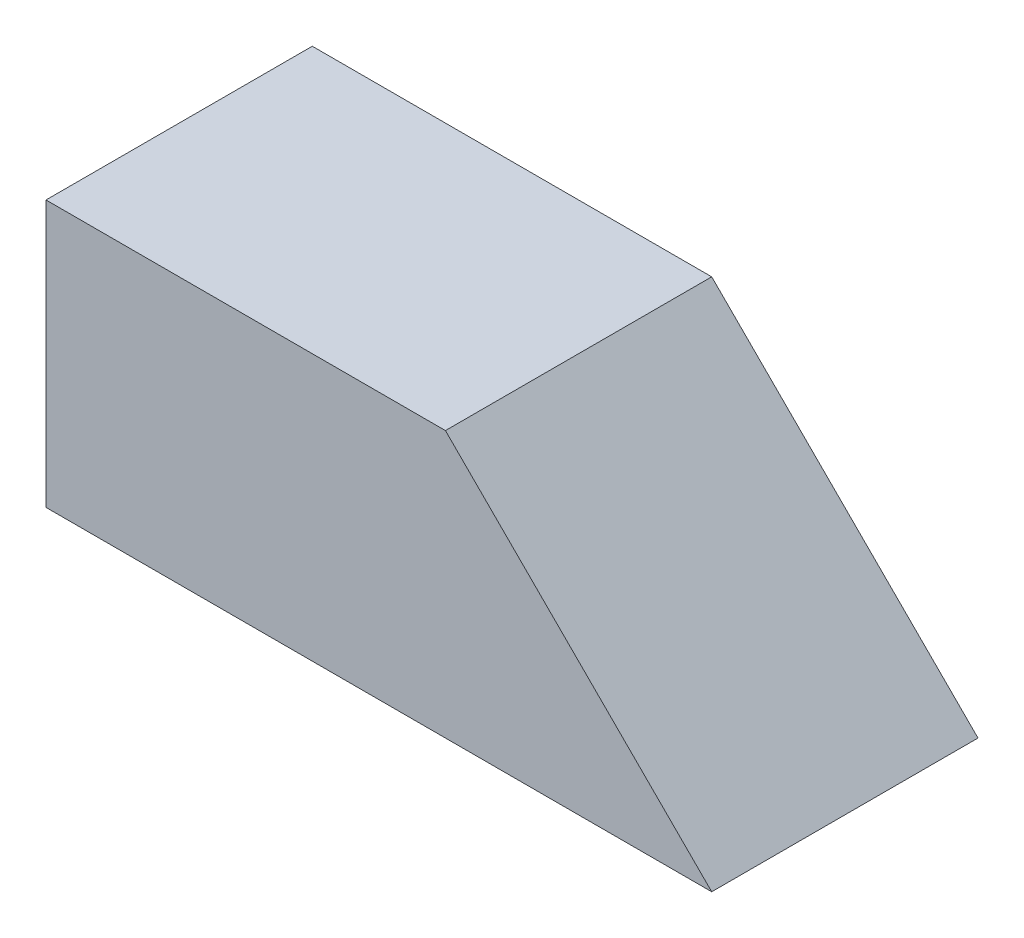
ISO-10303-21;
HEADER;
FILE_DESCRIPTION(('STEP AP214'),'2;1');
FILE_NAME('part.step','',(''),(''),'','','');
FILE_SCHEMA(('AUTOMOTIVE_DESIGN { 1 0 10303 214 1 1 1 1 }'));
ENDSEC;
DATA;
#1=APPLICATION_CONTEXT('core data for automotive mechanical design processes');
#2=APPLICATION_PROTOCOL_DEFINITION('international standard','automotive_design',2000,#1);
#3=PRODUCT_CONTEXT('',#1,'mechanical');
#4=PRODUCT('Part','Part','',(#3));
#5=PRODUCT_RELATED_PRODUCT_CATEGORY('part','',(#4));
#6=PRODUCT_DEFINITION_FORMATION('','',#4);
#7=PRODUCT_DEFINITION_CONTEXT('part definition',#1,'design');
#8=PRODUCT_DEFINITION('design','',#6,#7);
#9=PRODUCT_DEFINITION_SHAPE('','',#8);
#10=(LENGTH_UNIT() NAMED_UNIT(*) SI_UNIT(.MILLI.,.METRE.));
#11=(NAMED_UNIT(*) PLANE_ANGLE_UNIT() SI_UNIT($,.RADIAN.));
#12=(NAMED_UNIT(*) SI_UNIT($,.STERADIAN.) SOLID_ANGLE_UNIT());
#13=UNCERTAINTY_MEASURE_WITH_UNIT(LENGTH_MEASURE(1.E-05),#10,'distance_accuracy_value','');
#14=(GEOMETRIC_REPRESENTATION_CONTEXT(3) GLOBAL_UNCERTAINTY_ASSIGNED_CONTEXT((#13)) GLOBAL_UNIT_ASSIGNED_CONTEXT((#10,
#11,#12)) REPRESENTATION_CONTEXT('',''));
#15=CARTESIAN_POINT('',(0.,0.,0.));
#16=DIRECTION('',(0.,0.,1.));
#17=DIRECTION('',(1.,0.,0.));
#18=AXIS2_PLACEMENT_3D('',#15,#16,#17);
#19=CARTESIAN_POINT('',(-113.732958231518,21.4440433212995,20.));
#20=DIRECTION('',(1.,0.,0.));
#21=DIRECTION('',(0.,0.,-1.));
#22=AXIS2_PLACEMENT_3D('',#19,#20,#21);
#23=PLANE('',#22);
#24=DIRECTION('',(0.,-1.,0.));
#25=VECTOR('',#24,1.);
#26=CARTESIAN_POINT('',(-113.732958231518,21.4440433212995,0.));
#27=LINE('',#26,#25);
#28=CARTESIAN_POINT('',(-113.732958231518,21.4440433212995,0.));
#29=VERTEX_POINT('',#28);
#30=CARTESIAN_POINT('',(-113.732958231518,1.4440433212995,0.));
#31=VERTEX_POINT('',#30);
#32=EDGE_CURVE('E96',#29,#31,#27,.T.);
#33=ORIENTED_EDGE('',*,*,#32,.T.);
#34=DIRECTION('',(0.,0.,-1.));
#35=VECTOR('',#34,1.);
#36=CARTESIAN_POINT('',(-113.732958231518,1.4440433212995,20.));
#37=LINE('',#36,#35);
#38=CARTESIAN_POINT('',(-113.732958231518,1.4440433212995,20.));
#39=VERTEX_POINT('',#38);
#40=EDGE_CURVE('E11',#39,#31,#37,.T.);
#41=ORIENTED_EDGE('',*,*,#40,.F.);
#42=DIRECTION('',(0.,-1.,0.));
#43=VECTOR('',#42,1.);
#44=CARTESIAN_POINT('',(-113.732958231518,21.4440433212995,20.));
#45=LINE('',#44,#43);
#46=CARTESIAN_POINT('',(-113.732958231518,21.4440433212995,20.));
#47=VERTEX_POINT('',#46);
#48=EDGE_CURVE('E84',#47,#39,#45,.T.);
#49=ORIENTED_EDGE('',*,*,#48,.F.);
#50=DIRECTION('',(0.,0.,-1.));
#51=VECTOR('',#50,1.);
#52=CARTESIAN_POINT('',(-113.732958231518,21.4440433212995,20.));
#53=LINE('',#52,#51);
#54=EDGE_CURVE('E92',#47,#29,#53,.T.);
#55=ORIENTED_EDGE('',*,*,#54,.T.);
#56=EDGE_LOOP('',(#33,#41,#49,#55));
#57=FACE_BOUND('',#56,.T.);
#58=ADVANCED_FACE('F33',(#57),#23,.F.);
#59=CARTESIAN_POINT('',(-113.732958231518,1.4440433212995,20.));
#60=DIRECTION('',(0.,1.,0.));
#61=DIRECTION('',(0.,0.,1.));
#62=AXIS2_PLACEMENT_3D('',#59,#60,#61);
#63=PLANE('',#62);
#64=DIRECTION('',(1.,0.,0.));
#65=VECTOR('',#64,1.);
#66=CARTESIAN_POINT('',(-113.732958231518,1.4440433212995,0.));
#67=LINE('',#66,#65);
#68=CARTESIAN_POINT('',(-63.732958231518,1.4440433212995,0.));
#69=VERTEX_POINT('',#68);
#70=EDGE_CURVE('E88',#31,#69,#67,.T.);
#71=ORIENTED_EDGE('',*,*,#70,.T.);
#72=DIRECTION('',(0.,0.,-1.));
#73=VECTOR('',#72,1.);
#74=CARTESIAN_POINT('',(-63.732958231518,1.4440433212995,20.));
#75=LINE('',#74,#73);
#76=CARTESIAN_POINT('',(-63.732958231518,1.4440433212995,20.));
#77=VERTEX_POINT('',#76);
#78=EDGE_CURVE('E41',#77,#69,#75,.T.);
#79=ORIENTED_EDGE('',*,*,#78,.F.);
#80=DIRECTION('',(1.,0.,0.));
#81=VECTOR('',#80,1.);
#82=CARTESIAN_POINT('',(-113.732958231518,1.4440433212995,20.));
#83=LINE('',#82,#81);
#84=EDGE_CURVE('E79',#39,#77,#83,.T.);
#85=ORIENTED_EDGE('',*,*,#84,.F.);
#86=ORIENTED_EDGE('',*,*,#40,.T.);
#87=EDGE_LOOP('',(#71,#79,#85,#86));
#88=FACE_BOUND('',#87,.T.);
#89=ADVANCED_FACE('F87',(#88),#63,.F.);
#90=CARTESIAN_POINT('',(-63.732958231518,1.4440433212995,20.));
#91=DIRECTION('',(-0.707106781186544,-0.707106781186551,0.));
#92=DIRECTION('',(0.707106781186551,-0.707106781186544,0.));
#93=AXIS2_PLACEMENT_3D('',#90,#91,#92);
#94=PLANE('',#93);
#95=DIRECTION('',(-0.707106781186551,0.707106781186544,0.));
#96=VECTOR('',#95,1.);
#97=CARTESIAN_POINT('',(-63.732958231518,1.4440433212995,0.));
#98=LINE('',#97,#96);
#99=CARTESIAN_POINT('',(-83.7329582315183,21.4440433212995,0.));
#100=VERTEX_POINT('',#99);
#101=EDGE_CURVE('E66',#69,#100,#98,.T.);
#102=ORIENTED_EDGE('',*,*,#101,.T.);
#103=DIRECTION('',(0.,0.,-1.));
#104=VECTOR('',#103,1.);
#105=CARTESIAN_POINT('',(-83.7329582315183,21.4440433212995,20.));
#106=LINE('',#105,#104);
#107=CARTESIAN_POINT('',(-83.7329582315183,21.4440433212995,20.));
#108=VERTEX_POINT('',#107);
#109=EDGE_CURVE('E89',#108,#100,#106,.T.);
#110=ORIENTED_EDGE('',*,*,#109,.F.);
#111=DIRECTION('',(-0.707106781186551,0.707106781186544,0.));
#112=VECTOR('',#111,1.);
#113=CARTESIAN_POINT('',(-63.732958231518,1.4440433212995,20.));
#114=LINE('',#113,#112);
#115=EDGE_CURVE('E82',#77,#108,#114,.T.);
#116=ORIENTED_EDGE('',*,*,#115,.F.);
#117=ORIENTED_EDGE('',*,*,#78,.T.);
#118=EDGE_LOOP('',(#102,#110,#116,#117));
#119=FACE_BOUND('',#118,.T.);
#120=ADVANCED_FACE('F90',(#119),#94,.F.);
#121=CARTESIAN_POINT('',(-83.7329582315183,21.4440433212995,20.));
#122=DIRECTION('',(0.,-1.,0.));
#123=DIRECTION('',(1.,0.,0.));
#124=AXIS2_PLACEMENT_3D('',#121,#122,#123);
#125=PLANE('',#124);
#126=DIRECTION('',(-1.,0.,0.));
#127=VECTOR('',#126,1.);
#128=CARTESIAN_POINT('',(-83.7329582315183,21.4440433212995,0.));
#129=LINE('',#128,#127);
#130=EDGE_CURVE('E72',#100,#29,#129,.T.);
#131=ORIENTED_EDGE('',*,*,#130,.T.);
#132=ORIENTED_EDGE('',*,*,#54,.F.);
#133=DIRECTION('',(-1.,0.,0.));
#134=VECTOR('',#133,1.);
#135=CARTESIAN_POINT('',(-83.7329582315183,21.4440433212995,20.));
#136=LINE('',#135,#134);
#137=EDGE_CURVE('E49',#108,#47,#136,.T.);
#138=ORIENTED_EDGE('',*,*,#137,.F.);
#139=ORIENTED_EDGE('',*,*,#109,.T.);
#140=EDGE_LOOP('',(#131,#132,#138,#139));
#141=FACE_BOUND('',#140,.T.);
#142=ADVANCED_FACE('F103',(#141),#125,.F.);
#143=CARTESIAN_POINT('',(0.,0.,20.));
#144=DIRECTION('',(0.,0.,1.));
#145=DIRECTION('',(1.,0.,0.));
#146=AXIS2_PLACEMENT_3D('',#143,#144,#145);
#147=PLANE('',#146);
#148=ORIENTED_EDGE('',*,*,#48,.T.);
#149=ORIENTED_EDGE('',*,*,#84,.T.);
#150=ORIENTED_EDGE('',*,*,#115,.T.);
#151=ORIENTED_EDGE('',*,*,#137,.T.);
#152=EDGE_LOOP('',(#148,#149,#150,#151));
#153=FACE_BOUND('',#152,.T.);
#154=ADVANCED_FACE('F80',(#153),#147,.T.);
#155=CARTESIAN_POINT('',(0.,0.,0.));
#156=DIRECTION('',(0.,0.,1.));
#157=DIRECTION('',(1.,0.,0.));
#158=AXIS2_PLACEMENT_3D('',#155,#156,#157);
#159=PLANE('',#158);
#160=ORIENTED_EDGE('',*,*,#32,.F.);
#161=ORIENTED_EDGE('',*,*,#130,.F.);
#162=ORIENTED_EDGE('',*,*,#101,.F.);
#163=ORIENTED_EDGE('',*,*,#70,.F.);
#164=EDGE_LOOP('',(#160,#161,#162,#163));
#165=FACE_BOUND('',#164,.T.);
#166=ADVANCED_FACE('F106',(#165),#159,.F.);
#167=CLOSED_SHELL('',(#58,#89,#120,#142,#154,#166));
#168=MANIFOLD_SOLID_BREP('B2',#167);
#169=ADVANCED_BREP_SHAPE_REPRESENTATION('',(#18,#168),#14);
#170=SHAPE_DEFINITION_REPRESENTATION(#9,#169);
ENDSEC;
END-ISO-10303-21;
